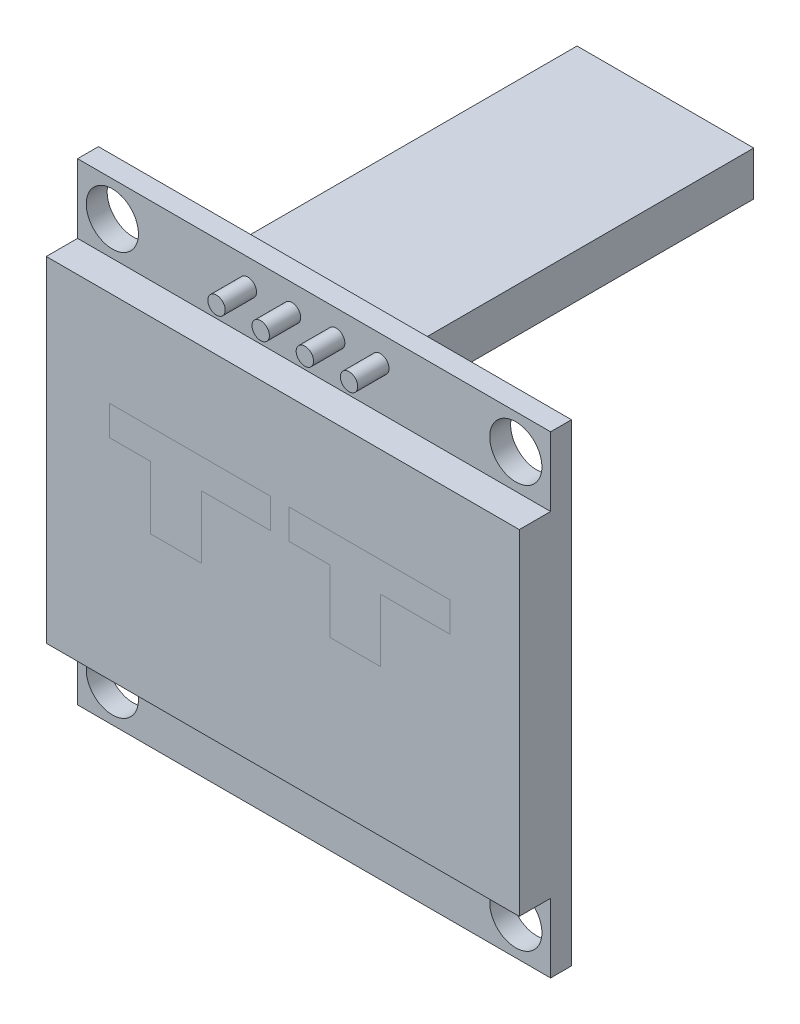
ISO-10303-21;
HEADER;
FILE_DESCRIPTION(('STEP AP214'),'2;1');
FILE_NAME('part.step','',(''),(''),'','','');
FILE_SCHEMA(('AUTOMOTIVE_DESIGN { 1 0 10303 214 1 1 1 1 }'));
ENDSEC;
DATA;
#1=APPLICATION_CONTEXT('core data for automotive mechanical design processes');
#2=APPLICATION_PROTOCOL_DEFINITION('international standard','automotive_design',2000,#1);
#3=PRODUCT_CONTEXT('',#1,'mechanical');
#4=PRODUCT('Part','Part','',(#3));
#5=PRODUCT_RELATED_PRODUCT_CATEGORY('part','',(#4));
#6=PRODUCT_DEFINITION_FORMATION('','',#4);
#7=PRODUCT_DEFINITION_CONTEXT('part definition',#1,'design');
#8=PRODUCT_DEFINITION('design','',#6,#7);
#9=PRODUCT_DEFINITION_SHAPE('','',#8);
#10=(LENGTH_UNIT() NAMED_UNIT(*) SI_UNIT(.MILLI.,.METRE.));
#11=(NAMED_UNIT(*) PLANE_ANGLE_UNIT() SI_UNIT($,.RADIAN.));
#12=(NAMED_UNIT(*) SI_UNIT($,.STERADIAN.) SOLID_ANGLE_UNIT());
#13=UNCERTAINTY_MEASURE_WITH_UNIT(LENGTH_MEASURE(1.E-05),#10,'distance_accuracy_value','');
#14=(GEOMETRIC_REPRESENTATION_CONTEXT(3) GLOBAL_UNCERTAINTY_ASSIGNED_CONTEXT((#13)) GLOBAL_UNIT_ASSIGNED_CONTEXT((#10,
#11,#12)) REPRESENTATION_CONTEXT('',''));
#15=CARTESIAN_POINT('',(0.,0.,0.));
#16=DIRECTION('',(0.,0.,1.));
#17=DIRECTION('',(1.,0.,0.));
#18=AXIS2_PLACEMENT_3D('',#15,#16,#17);
#19=CARTESIAN_POINT('',(0.,0.,3.));
#20=DIRECTION('',(0.,0.,-1.));
#21=DIRECTION('',(-1.,0.,0.));
#22=AXIS2_PLACEMENT_3D('',#19,#20,#21);
#23=PLANE('',#22);
#24=DIRECTION('',(-1.,0.,0.));
#25=VECTOR('',#24,1.);
#26=CARTESIAN_POINT('',(0.,4.13680802778878,3.));
#27=LINE('',#26,#25);
#28=CARTESIAN_POINT('',(-0.710729132527586,4.13680802778878,3.));
#29=VERTEX_POINT('',#28);
#30=CARTESIAN_POINT('',(-9.9684316792971,4.13680802778878,3.));
#31=VERTEX_POINT('',#30);
#32=EDGE_CURVE('E346',#29,#31,#27,.T.);
#33=ORIENTED_EDGE('',*,*,#32,.F.);
#34=DIRECTION('',(0.,1.,0.));
#35=VECTOR('',#34,1.);
#36=CARTESIAN_POINT('',(-0.710729132527586,0.,3.));
#37=LINE('',#36,#35);
#38=CARTESIAN_POINT('',(-0.710729132527586,2.4237685801582,3.));
#39=VERTEX_POINT('',#38);
#40=EDGE_CURVE('E315',#39,#29,#37,.T.);
#41=ORIENTED_EDGE('',*,*,#40,.F.);
#42=DIRECTION('',(1.,0.,0.));
#43=VECTOR('',#42,1.);
#44=CARTESIAN_POINT('',(0.,2.4237685801582,3.));
#45=LINE('',#44,#43);
#46=CARTESIAN_POINT('',(-4.68352274511765,2.4237685801582,3.));
#47=VERTEX_POINT('',#46);
#48=EDGE_CURVE('E328',#47,#39,#45,.T.);
#49=ORIENTED_EDGE('',*,*,#48,.F.);
#50=DIRECTION('',(0.,1.,0.));
#51=VECTOR('',#50,1.);
#52=CARTESIAN_POINT('',(-4.68352274511765,0.,3.));
#53=LINE('',#52,#51);
#54=CARTESIAN_POINT('',(-4.68352274511765,-1.1845485542126,3.));
#55=VERTEX_POINT('',#54);
#56=EDGE_CURVE('E331',#55,#47,#53,.T.);
#57=ORIENTED_EDGE('',*,*,#56,.F.);
#58=DIRECTION('',(1.,0.,0.));
#59=VECTOR('',#58,1.);
#60=CARTESIAN_POINT('',(0.,-1.1845485542126,3.));
#61=LINE('',#60,#59);
#62=CARTESIAN_POINT('',(-7.59933457087183,-1.1845485542126,3.));
#63=VERTEX_POINT('',#62);
#64=EDGE_CURVE('E334',#63,#55,#61,.T.);
#65=ORIENTED_EDGE('',*,*,#64,.F.);
#66=DIRECTION('',(0.,-1.,0.));
#67=VECTOR('',#66,1.);
#68=CARTESIAN_POINT('',(-7.59933457087183,0.,3.));
#69=LINE('',#68,#67);
#70=CARTESIAN_POINT('',(-7.59933457087183,2.4237685801582,3.));
#71=VERTEX_POINT('',#70);
#72=EDGE_CURVE('E337',#71,#63,#69,.T.);
#73=ORIENTED_EDGE('',*,*,#72,.F.);
#74=DIRECTION('',(1.,0.,0.));
#75=VECTOR('',#74,1.);
#76=CARTESIAN_POINT('',(0.,2.4237685801582,3.));
#77=LINE('',#76,#75);
#78=CARTESIAN_POINT('',(-9.9684316792971,2.4237685801582,3.));
#79=VERTEX_POINT('',#78);
#80=EDGE_CURVE('E340',#79,#71,#77,.T.);
#81=ORIENTED_EDGE('',*,*,#80,.F.);
#82=DIRECTION('',(0.,-1.,0.));
#83=VECTOR('',#82,1.);
#84=CARTESIAN_POINT('',(-9.9684316792971,0.,3.));
#85=LINE('',#84,#83);
#86=EDGE_CURVE('E343',#31,#79,#85,.T.);
#87=ORIENTED_EDGE('',*,*,#86,.F.);
#88=EDGE_LOOP('',(#33,#41,#49,#57,#65,#73,#81,#87));
#89=FACE_BOUND('',#88,.T.);
#90=DIRECTION('',(0.,1.,0.));
#91=VECTOR('',#90,1.);
#92=CARTESIAN_POINT('',(13.6,-9.63,3.));
#93=LINE('',#92,#91);
#94=CARTESIAN_POINT('',(13.6,-9.63,3.));
#95=VERTEX_POINT('',#94);
#96=CARTESIAN_POINT('',(13.6,9.63,3.));
#97=VERTEX_POINT('',#96);
#98=EDGE_CURVE('E258',#95,#97,#93,.T.);
#99=ORIENTED_EDGE('',*,*,#98,.T.);
#100=DIRECTION('',(-1.,0.,0.));
#101=VECTOR('',#100,1.);
#102=CARTESIAN_POINT('',(-13.6,9.63,3.));
#103=LINE('',#102,#101);
#104=CARTESIAN_POINT('',(-13.6,9.63,3.));
#105=VERTEX_POINT('',#104);
#106=EDGE_CURVE('E261',#97,#105,#103,.T.);
#107=ORIENTED_EDGE('',*,*,#106,.T.);
#108=DIRECTION('',(0.,-1.,0.));
#109=VECTOR('',#108,1.);
#110=CARTESIAN_POINT('',(-13.6,-9.63,3.));
#111=LINE('',#110,#109);
#112=CARTESIAN_POINT('',(-13.6,-9.63,3.));
#113=VERTEX_POINT('',#112);
#114=EDGE_CURVE('E264',#105,#113,#111,.T.);
#115=ORIENTED_EDGE('',*,*,#114,.T.);
#116=DIRECTION('',(1.,0.,0.));
#117=VECTOR('',#116,1.);
#118=CARTESIAN_POINT('',(-13.6,-9.63,3.));
#119=LINE('',#118,#117);
#120=EDGE_CURVE('E266',#113,#95,#119,.T.);
#121=ORIENTED_EDGE('',*,*,#120,.T.);
#122=EDGE_LOOP('',(#99,#107,#115,#121));
#123=FACE_BOUND('',#122,.T.);
#124=DIRECTION('',(-1.,0.,0.));
#125=VECTOR('',#124,1.);
#126=CARTESIAN_POINT('',(0.,4.13680802778878,3.));
#127=LINE('',#126,#125);
#128=CARTESIAN_POINT('',(9.60395520107782,4.13680802778878,3.));
#129=VERTEX_POINT('',#128);
#130=CARTESIAN_POINT('',(0.346252654308304,4.13680802778878,3.));
#131=VERTEX_POINT('',#130);
#132=EDGE_CURVE('E11',#129,#131,#127,.T.);
#133=ORIENTED_EDGE('',*,*,#132,.F.);
#134=DIRECTION('',(0.,1.,0.));
#135=VECTOR('',#134,1.);
#136=CARTESIAN_POINT('',(9.60395520107782,0.,3.));
#137=LINE('',#136,#135);
#138=CARTESIAN_POINT('',(9.60395520107782,2.4237685801582,3.));
#139=VERTEX_POINT('',#138);
#140=EDGE_CURVE('E349',#139,#129,#137,.T.);
#141=ORIENTED_EDGE('',*,*,#140,.F.);
#142=DIRECTION('',(1.,0.,0.));
#143=VECTOR('',#142,1.);
#144=CARTESIAN_POINT('',(0.,2.4237685801582,3.));
#145=LINE('',#144,#143);
#146=CARTESIAN_POINT('',(5.63116158848776,2.4237685801582,3.));
#147=VERTEX_POINT('',#146);
#148=EDGE_CURVE('E352',#147,#139,#145,.T.);
#149=ORIENTED_EDGE('',*,*,#148,.F.);
#150=DIRECTION('',(0.,1.,0.));
#151=VECTOR('',#150,1.);
#152=CARTESIAN_POINT('',(5.63116158848776,0.,3.));
#153=LINE('',#152,#151);
#154=CARTESIAN_POINT('',(5.63116158848776,-1.1845485542126,3.));
#155=VERTEX_POINT('',#154);
#156=EDGE_CURVE('E355',#155,#147,#153,.T.);
#157=ORIENTED_EDGE('',*,*,#156,.F.);
#158=DIRECTION('',(1.,0.,0.));
#159=VECTOR('',#158,1.);
#160=CARTESIAN_POINT('',(0.,-1.1845485542126,3.));
#161=LINE('',#160,#159);
#162=CARTESIAN_POINT('',(2.71534976273358,-1.1845485542126,3.));
#163=VERTEX_POINT('',#162);
#164=EDGE_CURVE('E358',#163,#155,#161,.T.);
#165=ORIENTED_EDGE('',*,*,#164,.F.);
#166=DIRECTION('',(0.,-1.,0.));
#167=VECTOR('',#166,1.);
#168=CARTESIAN_POINT('',(2.71534976273358,0.,3.));
#169=LINE('',#168,#167);
#170=CARTESIAN_POINT('',(2.71534976273358,2.4237685801582,3.));
#171=VERTEX_POINT('',#170);
#172=EDGE_CURVE('E361',#171,#163,#169,.T.);
#173=ORIENTED_EDGE('',*,*,#172,.F.);
#174=DIRECTION('',(1.,0.,0.));
#175=VECTOR('',#174,1.);
#176=CARTESIAN_POINT('',(0.,2.4237685801582,3.));
#177=LINE('',#176,#175);
#178=CARTESIAN_POINT('',(0.346252654308304,2.4237685801582,3.));
#179=VERTEX_POINT('',#178);
#180=EDGE_CURVE('E364',#179,#171,#177,.T.);
#181=ORIENTED_EDGE('',*,*,#180,.F.);
#182=DIRECTION('',(0.,-1.,0.));
#183=VECTOR('',#182,1.);
#184=CARTESIAN_POINT('',(0.346252654308304,0.,3.));
#185=LINE('',#184,#183);
#186=EDGE_CURVE('E52',#131,#179,#185,.T.);
#187=ORIENTED_EDGE('',*,*,#186,.F.);
#188=EDGE_LOOP('',(#133,#141,#149,#157,#165,#173,#181,#187));
#189=FACE_BOUND('',#188,.T.);
#190=ADVANCED_FACE('F43',(#89,#123,#189),#23,.F.);
#191=ORIENTED_EDGE('',*,*,#140,.T.);
#192=ORIENTED_EDGE('',*,*,#132,.T.);
#193=ORIENTED_EDGE('',*,*,#186,.T.);
#194=ORIENTED_EDGE('',*,*,#180,.T.);
#195=ORIENTED_EDGE('',*,*,#172,.T.);
#196=ORIENTED_EDGE('',*,*,#164,.T.);
#197=ORIENTED_EDGE('',*,*,#156,.T.);
#198=ORIENTED_EDGE('',*,*,#148,.T.);
#199=EDGE_LOOP('',(#191,#192,#193,#194,#195,#196,#197,#198));
#200=FACE_BOUND('',#199,.T.);
#201=ADVANCED_FACE('F400',(#200),#23,.F.);
#202=CARTESIAN_POINT('',(0.,0.,0.));
#203=DIRECTION('',(0.,0.,-1.));
#204=DIRECTION('',(-1.,0.,0.));
#205=AXIS2_PLACEMENT_3D('',#202,#203,#204);
#206=PLANE('',#205);
#207=DIRECTION('',(0.,1.,0.));
#208=VECTOR('',#207,1.);
#209=CARTESIAN_POINT('',(13.6,-13.6,0.));
#210=LINE('',#209,#208);
#211=CARTESIAN_POINT('',(13.6,-13.6,0.));
#212=VERTEX_POINT('',#211);
#213=CARTESIAN_POINT('',(13.6,13.6,0.));
#214=VERTEX_POINT('',#213);
#215=EDGE_CURVE('E284',#212,#214,#210,.T.);
#216=ORIENTED_EDGE('',*,*,#215,.F.);
#217=DIRECTION('',(1.,0.,0.));
#218=VECTOR('',#217,1.);
#219=CARTESIAN_POINT('',(-13.6,-13.6,0.));
#220=LINE('',#219,#218);
#221=CARTESIAN_POINT('',(-13.6,-13.6,0.));
#222=VERTEX_POINT('',#221);
#223=EDGE_CURVE('E302',#222,#212,#220,.T.);
#224=ORIENTED_EDGE('',*,*,#223,.F.);
#225=DIRECTION('',(0.,-1.,0.));
#226=VECTOR('',#225,1.);
#227=CARTESIAN_POINT('',(-13.6,-13.6,0.));
#228=LINE('',#227,#226);
#229=CARTESIAN_POINT('',(-13.6,13.6,0.));
#230=VERTEX_POINT('',#229);
#231=EDGE_CURVE('E300',#230,#222,#228,.T.);
#232=ORIENTED_EDGE('',*,*,#231,.F.);
#233=DIRECTION('',(-1.,0.,0.));
#234=VECTOR('',#233,1.);
#235=CARTESIAN_POINT('',(-13.6,13.6,0.));
#236=LINE('',#235,#234);
#237=EDGE_CURVE('E298',#214,#230,#236,.T.);
#238=ORIENTED_EDGE('',*,*,#237,.F.);
#239=EDGE_LOOP('',(#216,#224,#232,#238));
#240=FACE_BOUND('',#239,.T.);
#241=CARTESIAN_POINT('',(-11.6,11.6,0.));
#242=DIRECTION('',(0.,0.,-1.));
#243=DIRECTION('',(-1.,0.,0.));
#244=AXIS2_PLACEMENT_3D('',#241,#242,#243);
#245=CIRCLE('',#244,1.5);
#246=CARTESIAN_POINT('',(-13.1,11.6,0.));
#247=VERTEX_POINT('',#246);
#248=EDGE_CURVE('E231',#247,#247,#245,.T.);
#249=ORIENTED_EDGE('',*,*,#248,.F.);
#250=EDGE_LOOP('',(#249));
#251=FACE_BOUND('',#250,.T.);
#252=CARTESIAN_POINT('',(-11.6,-11.6,0.));
#253=DIRECTION('',(0.,0.,-1.));
#254=DIRECTION('',(-1.,0.,0.));
#255=AXIS2_PLACEMENT_3D('',#252,#253,#254);
#256=CIRCLE('',#255,1.5);
#257=CARTESIAN_POINT('',(-13.1,-11.6,0.));
#258=VERTEX_POINT('',#257);
#259=EDGE_CURVE('E222',#258,#258,#256,.T.);
#260=ORIENTED_EDGE('',*,*,#259,.F.);
#261=EDGE_LOOP('',(#260));
#262=FACE_BOUND('',#261,.T.);
#263=CARTESIAN_POINT('',(11.6,-11.6,0.));
#264=DIRECTION('',(0.,0.,-1.));
#265=DIRECTION('',(-1.,0.,0.));
#266=AXIS2_PLACEMENT_3D('',#263,#264,#265);
#267=CIRCLE('',#266,1.5);
#268=CARTESIAN_POINT('',(10.1,-11.6,0.));
#269=VERTEX_POINT('',#268);
#270=EDGE_CURVE('E320',#269,#269,#267,.T.);
#271=ORIENTED_EDGE('',*,*,#270,.F.);
#272=EDGE_LOOP('',(#271));
#273=FACE_BOUND('',#272,.T.);
#274=CARTESIAN_POINT('',(11.6,11.6,0.));
#275=DIRECTION('',(0.,0.,-1.));
#276=DIRECTION('',(-1.,0.,0.));
#277=AXIS2_PLACEMENT_3D('',#274,#275,#276);
#278=CIRCLE('',#277,1.5);
#279=CARTESIAN_POINT('',(10.1,11.6,0.));
#280=VERTEX_POINT('',#279);
#281=EDGE_CURVE('E232',#280,#280,#278,.T.);
#282=ORIENTED_EDGE('',*,*,#281,.F.);
#283=EDGE_LOOP('',(#282));
#284=FACE_BOUND('',#283,.T.);
#285=DIRECTION('',(-1.,0.,0.));
#286=VECTOR('',#285,1.);
#287=CARTESIAN_POINT('',(5.08,10.83,0.));
#288=LINE('',#287,#286);
#289=CARTESIAN_POINT('',(5.08,10.83,0.));
#290=VERTEX_POINT('',#289);
#291=CARTESIAN_POINT('',(-5.08,10.83,0.));
#292=VERTEX_POINT('',#291);
#293=EDGE_CURVE('E207',#290,#292,#288,.T.);
#294=ORIENTED_EDGE('',*,*,#293,.F.);
#295=DIRECTION('',(0.,-1.,0.));
#296=VECTOR('',#295,1.);
#297=CARTESIAN_POINT('',(5.08,10.83,0.));
#298=LINE('',#297,#296);
#299=CARTESIAN_POINT('',(5.08,13.37,0.));
#300=VERTEX_POINT('',#299);
#301=EDGE_CURVE('E183',#300,#290,#298,.T.);
#302=ORIENTED_EDGE('',*,*,#301,.F.);
#303=DIRECTION('',(1.,0.,0.));
#304=VECTOR('',#303,1.);
#305=CARTESIAN_POINT('',(5.08,13.37,0.));
#306=LINE('',#305,#304);
#307=CARTESIAN_POINT('',(-5.08,13.37,0.));
#308=VERTEX_POINT('',#307);
#309=EDGE_CURVE('E212',#308,#300,#306,.T.);
#310=ORIENTED_EDGE('',*,*,#309,.F.);
#311=DIRECTION('',(0.,1.,0.));
#312=VECTOR('',#311,1.);
#313=CARTESIAN_POINT('',(-5.08,10.83,0.));
#314=LINE('',#313,#312);
#315=EDGE_CURVE('E209',#292,#308,#314,.T.);
#316=ORIENTED_EDGE('',*,*,#315,.F.);
#317=EDGE_LOOP('',(#294,#302,#310,#316));
#318=FACE_BOUND('',#317,.T.);
#319=ADVANCED_FACE('F413',(#240,#251,#262,#273,#284,#318),#206,.T.);
#320=CARTESIAN_POINT('',(0.,0.,1.2));
#321=DIRECTION('',(0.,0.,-1.));
#322=DIRECTION('',(-1.,0.,0.));
#323=AXIS2_PLACEMENT_3D('',#320,#321,#322);
#324=PLANE('',#323);
#325=CARTESIAN_POINT('',(11.6,-11.6,1.2));
#326=DIRECTION('',(0.,0.,1.));
#327=DIRECTION('',(1.,0.,0.));
#328=AXIS2_PLACEMENT_3D('',#325,#326,#327);
#329=CIRCLE('',#328,1.5);
#330=CARTESIAN_POINT('',(13.1,-11.6,1.2));
#331=VERTEX_POINT('',#330);
#332=EDGE_CURVE('E223',#331,#331,#329,.T.);
#333=ORIENTED_EDGE('',*,*,#332,.F.);
#334=EDGE_LOOP('',(#333));
#335=FACE_BOUND('',#334,.T.);
#336=CARTESIAN_POINT('',(-11.6,-11.6,1.2));
#337=DIRECTION('',(0.,0.,1.));
#338=DIRECTION('',(1.,0.,0.));
#339=AXIS2_PLACEMENT_3D('',#336,#337,#338);
#340=CIRCLE('',#339,1.5);
#341=CARTESIAN_POINT('',(-10.1,-11.6,1.2));
#342=VERTEX_POINT('',#341);
#343=EDGE_CURVE('E186',#342,#342,#340,.T.);
#344=ORIENTED_EDGE('',*,*,#343,.F.);
#345=EDGE_LOOP('',(#344));
#346=FACE_BOUND('',#345,.T.);
#347=DIRECTION('',(1.,0.,0.));
#348=VECTOR('',#347,1.);
#349=CARTESIAN_POINT('',(-13.6,-9.63,1.2));
#350=LINE('',#349,#348);
#351=CARTESIAN_POINT('',(-13.6,-9.63,1.2));
#352=VERTEX_POINT('',#351);
#353=CARTESIAN_POINT('',(13.6,-9.63,1.2));
#354=VERTEX_POINT('',#353);
#355=EDGE_CURVE('E262',#352,#354,#350,.T.);
#356=ORIENTED_EDGE('',*,*,#355,.F.);
#357=DIRECTION('',(0.,-1.,0.));
#358=VECTOR('',#357,1.);
#359=CARTESIAN_POINT('',(-13.6,-13.6,1.2));
#360=LINE('',#359,#358);
#361=CARTESIAN_POINT('',(-13.6,-13.6,1.2));
#362=VERTEX_POINT('',#361);
#363=EDGE_CURVE('E290',#352,#362,#360,.T.);
#364=ORIENTED_EDGE('',*,*,#363,.T.);
#365=DIRECTION('',(1.,0.,0.));
#366=VECTOR('',#365,1.);
#367=CARTESIAN_POINT('',(-13.6,-13.6,1.2));
#368=LINE('',#367,#366);
#369=CARTESIAN_POINT('',(13.6,-13.6,1.2));
#370=VERTEX_POINT('',#369);
#371=EDGE_CURVE('E293',#362,#370,#368,.T.);
#372=ORIENTED_EDGE('',*,*,#371,.T.);
#373=DIRECTION('',(0.,1.,0.));
#374=VECTOR('',#373,1.);
#375=CARTESIAN_POINT('',(13.6,-13.6,1.2));
#376=LINE('',#375,#374);
#377=EDGE_CURVE('E285',#370,#354,#376,.T.);
#378=ORIENTED_EDGE('',*,*,#377,.T.);
#379=EDGE_LOOP('',(#356,#364,#372,#378));
#380=FACE_BOUND('',#379,.T.);
#381=ADVANCED_FACE('F443',(#335,#346,#380),#324,.F.);
#382=CARTESIAN_POINT('',(11.6,11.6,1.2));
#383=DIRECTION('',(0.,0.,1.));
#384=DIRECTION('',(1.,0.,0.));
#385=AXIS2_PLACEMENT_3D('',#382,#383,#384);
#386=CIRCLE('',#385,1.5);
#387=CARTESIAN_POINT('',(13.1,11.6,1.2));
#388=VERTEX_POINT('',#387);
#389=EDGE_CURVE('E219',#388,#388,#386,.T.);
#390=ORIENTED_EDGE('',*,*,#389,.F.);
#391=EDGE_LOOP('',(#390));
#392=FACE_BOUND('',#391,.T.);
#393=CARTESIAN_POINT('',(-11.6,11.6,1.2));
#394=DIRECTION('',(0.,0.,1.));
#395=DIRECTION('',(1.,0.,0.));
#396=AXIS2_PLACEMENT_3D('',#393,#394,#395);
#397=CIRCLE('',#396,1.5);
#398=CARTESIAN_POINT('',(-10.1,11.6,1.2));
#399=VERTEX_POINT('',#398);
#400=EDGE_CURVE('E228',#399,#399,#397,.T.);
#401=ORIENTED_EDGE('',*,*,#400,.F.);
#402=EDGE_LOOP('',(#401));
#403=FACE_BOUND('',#402,.T.);
#404=CARTESIAN_POINT('',(3.81,12.1,1.2));
#405=DIRECTION('',(0.,0.,-1.));
#406=DIRECTION('',(-1.,0.,0.));
#407=AXIS2_PLACEMENT_3D('',#404,#405,#406);
#408=CIRCLE('',#407,0.500000000000001);
#409=CARTESIAN_POINT('',(3.31,12.1,1.2));
#410=VERTEX_POINT('',#409);
#411=EDGE_CURVE('E236',#410,#410,#408,.T.);
#412=ORIENTED_EDGE('',*,*,#411,.T.);
#413=EDGE_LOOP('',(#412));
#414=FACE_BOUND('',#413,.T.);
#415=CARTESIAN_POINT('',(1.27,12.1,1.2));
#416=DIRECTION('',(0.,0.,-1.));
#417=DIRECTION('',(-1.,0.,0.));
#418=AXIS2_PLACEMENT_3D('',#415,#416,#417);
#419=CIRCLE('',#418,0.5);
#420=CARTESIAN_POINT('',(0.770000000000003,12.1,1.2));
#421=VERTEX_POINT('',#420);
#422=EDGE_CURVE('E242',#421,#421,#419,.T.);
#423=ORIENTED_EDGE('',*,*,#422,.T.);
#424=EDGE_LOOP('',(#423));
#425=FACE_BOUND('',#424,.T.);
#426=CARTESIAN_POINT('',(-1.27,12.1,1.2));
#427=DIRECTION('',(0.,0.,-1.));
#428=DIRECTION('',(-1.,0.,0.));
#429=AXIS2_PLACEMENT_3D('',#426,#427,#428);
#430=CIRCLE('',#429,0.5);
#431=CARTESIAN_POINT('',(-1.77,12.1,1.2));
#432=VERTEX_POINT('',#431);
#433=EDGE_CURVE('E248',#432,#432,#430,.T.);
#434=ORIENTED_EDGE('',*,*,#433,.T.);
#435=EDGE_LOOP('',(#434));
#436=FACE_BOUND('',#435,.T.);
#437=CARTESIAN_POINT('',(-3.81,12.1,1.2));
#438=DIRECTION('',(0.,0.,-1.));
#439=DIRECTION('',(-1.,0.,0.));
#440=AXIS2_PLACEMENT_3D('',#437,#438,#439);
#441=CIRCLE('',#440,0.5);
#442=CARTESIAN_POINT('',(-4.31,12.1,1.2));
#443=VERTEX_POINT('',#442);
#444=EDGE_CURVE('E254',#443,#443,#441,.T.);
#445=ORIENTED_EDGE('',*,*,#444,.T.);
#446=EDGE_LOOP('',(#445));
#447=FACE_BOUND('',#446,.T.);
#448=DIRECTION('',(-1.,0.,0.));
#449=VECTOR('',#448,1.);
#450=CARTESIAN_POINT('',(-13.6,9.63,1.2));
#451=LINE('',#450,#449);
#452=CARTESIAN_POINT('',(13.6,9.63,1.2));
#453=VERTEX_POINT('',#452);
#454=CARTESIAN_POINT('',(-13.6,9.63,1.2));
#455=VERTEX_POINT('',#454);
#456=EDGE_CURVE('E257',#453,#455,#451,.T.);
#457=ORIENTED_EDGE('',*,*,#456,.F.);
#458=CARTESIAN_POINT('',(13.6,13.6,1.2));
#459=VERTEX_POINT('',#458);
#460=EDGE_CURVE('E288',#453,#459,#376,.T.);
#461=ORIENTED_EDGE('',*,*,#460,.T.);
#462=DIRECTION('',(-1.,0.,0.));
#463=VECTOR('',#462,1.);
#464=CARTESIAN_POINT('',(-13.6,13.6,1.2));
#465=LINE('',#464,#463);
#466=CARTESIAN_POINT('',(-13.6,13.6,1.2));
#467=VERTEX_POINT('',#466);
#468=EDGE_CURVE('E287',#459,#467,#465,.T.);
#469=ORIENTED_EDGE('',*,*,#468,.T.);
#470=EDGE_CURVE('E291',#467,#455,#360,.T.);
#471=ORIENTED_EDGE('',*,*,#470,.T.);
#472=EDGE_LOOP('',(#457,#461,#469,#471));
#473=FACE_BOUND('',#472,.T.);
#474=ADVANCED_FACE('F446',(#392,#403,#414,#425,#436,#447,#473),#324,.F.);
#475=CARTESIAN_POINT('',(13.6,-13.6,1.2));
#476=DIRECTION('',(-1.,0.,0.));
#477=DIRECTION('',(0.,0.,1.));
#478=AXIS2_PLACEMENT_3D('',#475,#476,#477);
#479=PLANE('',#478);
#480=ORIENTED_EDGE('',*,*,#215,.T.);
#481=DIRECTION('',(0.,0.,-1.));
#482=VECTOR('',#481,1.);
#483=CARTESIAN_POINT('',(13.6,13.6,1.2));
#484=LINE('',#483,#482);
#485=EDGE_CURVE('E312',#459,#214,#484,.T.);
#486=ORIENTED_EDGE('',*,*,#485,.F.);
#487=ORIENTED_EDGE('',*,*,#460,.F.);
#488=DIRECTION('',(0.,0.,-1.));
#489=VECTOR('',#488,1.);
#490=CARTESIAN_POINT('',(13.6,9.63,3.));
#491=LINE('',#490,#489);
#492=EDGE_CURVE('E281',#97,#453,#491,.T.);
#493=ORIENTED_EDGE('',*,*,#492,.F.);
#494=ORIENTED_EDGE('',*,*,#98,.F.);
#495=DIRECTION('',(0.,0.,-1.));
#496=VECTOR('',#495,1.);
#497=CARTESIAN_POINT('',(13.6,-9.63,3.));
#498=LINE('',#497,#496);
#499=EDGE_CURVE('E268',#95,#354,#498,.T.);
#500=ORIENTED_EDGE('',*,*,#499,.T.);
#501=ORIENTED_EDGE('',*,*,#377,.F.);
#502=DIRECTION('',(0.,0.,-1.));
#503=VECTOR('',#502,1.);
#504=CARTESIAN_POINT('',(13.6,-13.6,1.2));
#505=LINE('',#504,#503);
#506=EDGE_CURVE('E295',#370,#212,#505,.T.);
#507=ORIENTED_EDGE('',*,*,#506,.T.);
#508=EDGE_LOOP('',(#480,#486,#487,#493,#494,#500,#501,#507));
#509=FACE_BOUND('',#508,.T.);
#510=ADVANCED_FACE('F45',(#509),#479,.F.);
#511=CARTESIAN_POINT('',(-13.6,13.6,1.2));
#512=DIRECTION('',(0.,-1.,0.));
#513=DIRECTION('',(0.,0.,-1.));
#514=AXIS2_PLACEMENT_3D('',#511,#512,#513);
#515=PLANE('',#514);
#516=ORIENTED_EDGE('',*,*,#237,.T.);
#517=DIRECTION('',(0.,0.,-1.));
#518=VECTOR('',#517,1.);
#519=CARTESIAN_POINT('',(-13.6,13.6,1.2));
#520=LINE('',#519,#518);
#521=EDGE_CURVE('E309',#467,#230,#520,.T.);
#522=ORIENTED_EDGE('',*,*,#521,.F.);
#523=ORIENTED_EDGE('',*,*,#468,.F.);
#524=ORIENTED_EDGE('',*,*,#485,.T.);
#525=EDGE_LOOP('',(#516,#522,#523,#524));
#526=FACE_BOUND('',#525,.T.);
#527=ADVANCED_FACE('F456',(#526),#515,.F.);
#528=CARTESIAN_POINT('',(-13.6,-13.6,1.2));
#529=DIRECTION('',(1.,0.,0.));
#530=DIRECTION('',(0.,0.,-1.));
#531=AXIS2_PLACEMENT_3D('',#528,#529,#530);
#532=PLANE('',#531);
#533=ORIENTED_EDGE('',*,*,#231,.T.);
#534=DIRECTION('',(0.,0.,-1.));
#535=VECTOR('',#534,1.);
#536=CARTESIAN_POINT('',(-13.6,-13.6,1.2));
#537=LINE('',#536,#535);
#538=EDGE_CURVE('E306',#362,#222,#537,.T.);
#539=ORIENTED_EDGE('',*,*,#538,.F.);
#540=ORIENTED_EDGE('',*,*,#363,.F.);
#541=DIRECTION('',(0.,0.,-1.));
#542=VECTOR('',#541,1.);
#543=CARTESIAN_POINT('',(-13.6,-9.63,3.));
#544=LINE('',#543,#542);
#545=EDGE_CURVE('E275',#113,#352,#544,.T.);
#546=ORIENTED_EDGE('',*,*,#545,.F.);
#547=ORIENTED_EDGE('',*,*,#114,.F.);
#548=DIRECTION('',(0.,0.,-1.));
#549=VECTOR('',#548,1.);
#550=CARTESIAN_POINT('',(-13.6,9.63,3.));
#551=LINE('',#550,#549);
#552=EDGE_CURVE('E278',#105,#455,#551,.T.);
#553=ORIENTED_EDGE('',*,*,#552,.T.);
#554=ORIENTED_EDGE('',*,*,#470,.F.);
#555=ORIENTED_EDGE('',*,*,#521,.T.);
#556=EDGE_LOOP('',(#533,#539,#540,#546,#547,#553,#554,#555));
#557=FACE_BOUND('',#556,.T.);
#558=ADVANCED_FACE('F453',(#557),#532,.F.);
#559=CARTESIAN_POINT('',(-13.6,-13.6,1.2));
#560=DIRECTION('',(0.,1.,0.));
#561=DIRECTION('',(0.,0.,1.));
#562=AXIS2_PLACEMENT_3D('',#559,#560,#561);
#563=PLANE('',#562);
#564=ORIENTED_EDGE('',*,*,#223,.T.);
#565=ORIENTED_EDGE('',*,*,#506,.F.);
#566=ORIENTED_EDGE('',*,*,#371,.F.);
#567=ORIENTED_EDGE('',*,*,#538,.T.);
#568=EDGE_LOOP('',(#564,#565,#566,#567));
#569=FACE_BOUND('',#568,.T.);
#570=ADVANCED_FACE('F439',(#569),#563,.F.);
#571=CARTESIAN_POINT('',(-13.6,9.63,3.));
#572=DIRECTION('',(0.,-1.,0.));
#573=DIRECTION('',(0.,0.,-1.));
#574=AXIS2_PLACEMENT_3D('',#571,#572,#573);
#575=PLANE('',#574);
#576=ORIENTED_EDGE('',*,*,#456,.T.);
#577=ORIENTED_EDGE('',*,*,#552,.F.);
#578=ORIENTED_EDGE('',*,*,#106,.F.);
#579=ORIENTED_EDGE('',*,*,#492,.T.);
#580=EDGE_LOOP('',(#576,#577,#578,#579));
#581=FACE_BOUND('',#580,.T.);
#582=ADVANCED_FACE('F427',(#581),#575,.F.);
#583=CARTESIAN_POINT('',(-13.6,-9.63,3.));
#584=DIRECTION('',(0.,1.,0.));
#585=DIRECTION('',(0.,0.,1.));
#586=AXIS2_PLACEMENT_3D('',#583,#584,#585);
#587=PLANE('',#586);
#588=ORIENTED_EDGE('',*,*,#355,.T.);
#589=ORIENTED_EDGE('',*,*,#499,.F.);
#590=ORIENTED_EDGE('',*,*,#120,.F.);
#591=ORIENTED_EDGE('',*,*,#545,.T.);
#592=EDGE_LOOP('',(#588,#589,#590,#591));
#593=FACE_BOUND('',#592,.T.);
#594=ADVANCED_FACE('F419',(#593),#587,.F.);
#595=ORIENTED_EDGE('',*,*,#40,.T.);
#596=ORIENTED_EDGE('',*,*,#32,.T.);
#597=ORIENTED_EDGE('',*,*,#86,.T.);
#598=ORIENTED_EDGE('',*,*,#80,.T.);
#599=ORIENTED_EDGE('',*,*,#72,.T.);
#600=ORIENTED_EDGE('',*,*,#64,.T.);
#601=ORIENTED_EDGE('',*,*,#56,.T.);
#602=ORIENTED_EDGE('',*,*,#48,.T.);
#603=EDGE_LOOP('',(#595,#596,#597,#598,#599,#600,#601,#602));
#604=FACE_BOUND('',#603,.T.);
#605=ADVANCED_FACE('F409',(#604),#23,.F.);
#606=CARTESIAN_POINT('',(-3.81,12.1,-8.));
#607=DIRECTION('',(0.,0.,1.));
#608=DIRECTION('',(1.,0.,0.));
#609=AXIS2_PLACEMENT_3D('',#606,#607,#608);
#610=CYLINDRICAL_SURFACE('',#609,0.5);
#611=CARTESIAN_POINT('',(-3.81,12.1,3.));
#612=DIRECTION('',(0.,0.,-1.));
#613=DIRECTION('',(-1.,0.,0.));
#614=AXIS2_PLACEMENT_3D('',#611,#612,#613);
#615=CIRCLE('',#614,0.5);
#616=CARTESIAN_POINT('',(-4.31,12.1,3.));
#617=VERTEX_POINT('',#616);
#618=EDGE_CURVE('E251',#617,#617,#615,.T.);
#619=ORIENTED_EDGE('',*,*,#618,.T.);
#620=EDGE_LOOP('',(#619));
#621=FACE_BOUND('',#620,.T.);
#622=ORIENTED_EDGE('',*,*,#444,.F.);
#623=EDGE_LOOP('',(#622));
#624=FACE_BOUND('',#623,.T.);
#625=ADVANCED_FACE('F418',(#621,#624),#610,.T.);
#626=CARTESIAN_POINT('',(0.,0.,3.));
#627=DIRECTION('',(0.,0.,-1.));
#628=DIRECTION('',(-1.,0.,0.));
#629=AXIS2_PLACEMENT_3D('',#626,#627,#628);
#630=PLANE('',#629);
#631=ORIENTED_EDGE('',*,*,#618,.F.);
#632=EDGE_LOOP('',(#631));
#633=FACE_BOUND('',#632,.T.);
#634=ADVANCED_FACE('F425',(#633),#630,.F.);
#635=CARTESIAN_POINT('',(-1.27,12.1,-8.));
#636=DIRECTION('',(0.,0.,1.));
#637=DIRECTION('',(1.,0.,0.));
#638=AXIS2_PLACEMENT_3D('',#635,#636,#637);
#639=CYLINDRICAL_SURFACE('',#638,0.5);
#640=CARTESIAN_POINT('',(-1.27,12.1,3.));
#641=DIRECTION('',(0.,0.,-1.));
#642=DIRECTION('',(-1.,0.,0.));
#643=AXIS2_PLACEMENT_3D('',#640,#641,#642);
#644=CIRCLE('',#643,0.5);
#645=CARTESIAN_POINT('',(-1.77,12.1,3.));
#646=VERTEX_POINT('',#645);
#647=EDGE_CURVE('E245',#646,#646,#644,.T.);
#648=ORIENTED_EDGE('',*,*,#647,.T.);
#649=EDGE_LOOP('',(#648));
#650=FACE_BOUND('',#649,.T.);
#651=ORIENTED_EDGE('',*,*,#433,.F.);
#652=EDGE_LOOP('',(#651));
#653=FACE_BOUND('',#652,.T.);
#654=ADVANCED_FACE('F504',(#650,#653),#639,.T.);
#655=CARTESIAN_POINT('',(0.,0.,3.));
#656=DIRECTION('',(0.,0.,-1.));
#657=DIRECTION('',(-1.,0.,0.));
#658=AXIS2_PLACEMENT_3D('',#655,#656,#657);
#659=PLANE('',#658);
#660=ORIENTED_EDGE('',*,*,#647,.F.);
#661=EDGE_LOOP('',(#660));
#662=FACE_BOUND('',#661,.T.);
#663=ADVANCED_FACE('F506',(#662),#659,.F.);
#664=CARTESIAN_POINT('',(1.27,12.1,-8.));
#665=DIRECTION('',(0.,0.,1.));
#666=DIRECTION('',(1.,0.,0.));
#667=AXIS2_PLACEMENT_3D('',#664,#665,#666);
#668=CYLINDRICAL_SURFACE('',#667,0.5);
#669=CARTESIAN_POINT('',(1.27,12.1,3.));
#670=DIRECTION('',(0.,0.,-1.));
#671=DIRECTION('',(-1.,0.,0.));
#672=AXIS2_PLACEMENT_3D('',#669,#670,#671);
#673=CIRCLE('',#672,0.5);
#674=CARTESIAN_POINT('',(0.770000000000003,12.1,3.));
#675=VERTEX_POINT('',#674);
#676=EDGE_CURVE('E239',#675,#675,#673,.T.);
#677=ORIENTED_EDGE('',*,*,#676,.T.);
#678=EDGE_LOOP('',(#677));
#679=FACE_BOUND('',#678,.T.);
#680=ORIENTED_EDGE('',*,*,#422,.F.);
#681=EDGE_LOOP('',(#680));
#682=FACE_BOUND('',#681,.T.);
#683=ADVANCED_FACE('F513',(#679,#682),#668,.T.);
#684=CARTESIAN_POINT('',(0.,0.,3.));
#685=DIRECTION('',(0.,0.,-1.));
#686=DIRECTION('',(-1.,0.,0.));
#687=AXIS2_PLACEMENT_3D('',#684,#685,#686);
#688=PLANE('',#687);
#689=ORIENTED_EDGE('',*,*,#676,.F.);
#690=EDGE_LOOP('',(#689));
#691=FACE_BOUND('',#690,.T.);
#692=ADVANCED_FACE('F521',(#691),#688,.F.);
#693=CARTESIAN_POINT('',(3.81,12.1,-8.));
#694=DIRECTION('',(0.,0.,1.));
#695=DIRECTION('',(1.,0.,0.));
#696=AXIS2_PLACEMENT_3D('',#693,#694,#695);
#697=CYLINDRICAL_SURFACE('',#696,0.500000000000001);
#698=CARTESIAN_POINT('',(3.81,12.1,3.));
#699=DIRECTION('',(0.,0.,-1.));
#700=DIRECTION('',(-1.,0.,0.));
#701=AXIS2_PLACEMENT_3D('',#698,#699,#700);
#702=CIRCLE('',#701,0.500000000000001);
#703=CARTESIAN_POINT('',(3.31,12.1,3.));
#704=VERTEX_POINT('',#703);
#705=EDGE_CURVE('E233',#704,#704,#702,.T.);
#706=ORIENTED_EDGE('',*,*,#705,.T.);
#707=EDGE_LOOP('',(#706));
#708=FACE_BOUND('',#707,.T.);
#709=ORIENTED_EDGE('',*,*,#411,.F.);
#710=EDGE_LOOP('',(#709));
#711=FACE_BOUND('',#710,.T.);
#712=ADVANCED_FACE('F525',(#708,#711),#697,.T.);
#713=CARTESIAN_POINT('',(0.,0.,3.));
#714=DIRECTION('',(0.,0.,-1.));
#715=DIRECTION('',(-1.,0.,0.));
#716=AXIS2_PLACEMENT_3D('',#713,#714,#715);
#717=PLANE('',#716);
#718=ORIENTED_EDGE('',*,*,#705,.F.);
#719=EDGE_LOOP('',(#718));
#720=FACE_BOUND('',#719,.T.);
#721=ADVANCED_FACE('F529',(#720),#717,.F.);
#722=CARTESIAN_POINT('',(-11.6,11.6,-8.));
#723=DIRECTION('',(0.,0.,1.));
#724=DIRECTION('',(1.,0.,0.));
#725=AXIS2_PLACEMENT_3D('',#722,#723,#724);
#726=CYLINDRICAL_SURFACE('',#725,1.5);
#727=ORIENTED_EDGE('',*,*,#248,.T.);
#728=EDGE_LOOP('',(#727));
#729=FACE_BOUND('',#728,.T.);
#730=ORIENTED_EDGE('',*,*,#400,.T.);
#731=EDGE_LOOP('',(#730));
#732=FACE_BOUND('',#731,.T.);
#733=ADVANCED_FACE('F533',(#729,#732),#726,.F.);
#734=CARTESIAN_POINT('',(-11.6,-11.6,-8.));
#735=DIRECTION('',(0.,0.,1.));
#736=DIRECTION('',(1.,0.,0.));
#737=AXIS2_PLACEMENT_3D('',#734,#735,#736);
#738=CYLINDRICAL_SURFACE('',#737,1.5);
#739=ORIENTED_EDGE('',*,*,#259,.T.);
#740=EDGE_LOOP('',(#739));
#741=FACE_BOUND('',#740,.T.);
#742=ORIENTED_EDGE('',*,*,#343,.T.);
#743=EDGE_LOOP('',(#742));
#744=FACE_BOUND('',#743,.T.);
#745=ADVANCED_FACE('F537',(#741,#744),#738,.F.);
#746=CARTESIAN_POINT('',(11.6,-11.6,-8.));
#747=DIRECTION('',(0.,0.,1.));
#748=DIRECTION('',(1.,0.,0.));
#749=AXIS2_PLACEMENT_3D('',#746,#747,#748);
#750=CYLINDRICAL_SURFACE('',#749,1.5);
#751=ORIENTED_EDGE('',*,*,#270,.T.);
#752=EDGE_LOOP('',(#751));
#753=FACE_BOUND('',#752,.T.);
#754=ORIENTED_EDGE('',*,*,#332,.T.);
#755=EDGE_LOOP('',(#754));
#756=FACE_BOUND('',#755,.T.);
#757=ADVANCED_FACE('F541',(#753,#756),#750,.F.);
#758=CARTESIAN_POINT('',(11.6,11.6,-8.));
#759=DIRECTION('',(0.,0.,1.));
#760=DIRECTION('',(1.,0.,0.));
#761=AXIS2_PLACEMENT_3D('',#758,#759,#760);
#762=CYLINDRICAL_SURFACE('',#761,1.5);
#763=ORIENTED_EDGE('',*,*,#281,.T.);
#764=EDGE_LOOP('',(#763));
#765=FACE_BOUND('',#764,.T.);
#766=ORIENTED_EDGE('',*,*,#389,.T.);
#767=EDGE_LOOP('',(#766));
#768=FACE_BOUND('',#767,.T.);
#769=ADVANCED_FACE('F545',(#765,#768),#762,.F.);
#770=CARTESIAN_POINT('',(5.08,10.83,-2.));
#771=DIRECTION('',(-1.,0.,0.));
#772=DIRECTION('',(0.,0.,1.));
#773=AXIS2_PLACEMENT_3D('',#770,#771,#772);
#774=PLANE('',#773);
#775=ORIENTED_EDGE('',*,*,#301,.T.);
#776=DIRECTION('',(0.,0.,1.));
#777=VECTOR('',#776,1.);
#778=CARTESIAN_POINT('',(5.08,10.83,-2.));
#779=LINE('',#778,#777);
#780=CARTESIAN_POINT('',(5.08,10.83,-19.));
#781=VERTEX_POINT('',#780);
#782=EDGE_CURVE('E176',#781,#290,#779,.T.);
#783=ORIENTED_EDGE('',*,*,#782,.F.);
#784=DIRECTION('',(0.,-1.,0.));
#785=VECTOR('',#784,1.);
#786=CARTESIAN_POINT('',(5.08000000000001,13.37,-19.));
#787=LINE('',#786,#785);
#788=CARTESIAN_POINT('',(5.08000000000001,13.37,-19.));
#789=VERTEX_POINT('',#788);
#790=EDGE_CURVE('E181',#789,#781,#787,.T.);
#791=ORIENTED_EDGE('',*,*,#790,.F.);
#792=DIRECTION('',(0.,0.,1.));
#793=VECTOR('',#792,1.);
#794=CARTESIAN_POINT('',(5.08,13.37,-2.));
#795=LINE('',#794,#793);
#796=EDGE_CURVE('E214',#789,#300,#795,.T.);
#797=ORIENTED_EDGE('',*,*,#796,.T.);
#798=EDGE_LOOP('',(#775,#783,#791,#797));
#799=FACE_BOUND('',#798,.T.);
#800=ADVANCED_FACE('F178',(#799),#774,.F.);
#801=CARTESIAN_POINT('',(5.08,10.83,-2.));
#802=DIRECTION('',(0.,1.,0.));
#803=DIRECTION('',(0.,0.,1.));
#804=AXIS2_PLACEMENT_3D('',#801,#802,#803);
#805=PLANE('',#804);
#806=ORIENTED_EDGE('',*,*,#293,.T.);
#807=DIRECTION('',(0.,0.,1.));
#808=VECTOR('',#807,1.);
#809=CARTESIAN_POINT('',(-5.08,10.83,-2.));
#810=LINE('',#809,#808);
#811=CARTESIAN_POINT('',(-5.08,10.83,-19.));
#812=VERTEX_POINT('',#811);
#813=EDGE_CURVE('E187',#812,#292,#810,.T.);
#814=ORIENTED_EDGE('',*,*,#813,.F.);
#815=DIRECTION('',(-1.,0.,0.));
#816=VECTOR('',#815,1.);
#817=CARTESIAN_POINT('',(5.08,10.83,-19.));
#818=LINE('',#817,#816);
#819=EDGE_CURVE('E190',#781,#812,#818,.T.);
#820=ORIENTED_EDGE('',*,*,#819,.F.);
#821=ORIENTED_EDGE('',*,*,#782,.T.);
#822=EDGE_LOOP('',(#806,#814,#820,#821));
#823=FACE_BOUND('',#822,.T.);
#824=ADVANCED_FACE('F191',(#823),#805,.F.);
#825=CARTESIAN_POINT('',(-5.08,10.83,-2.));
#826=DIRECTION('',(1.,0.,0.));
#827=DIRECTION('',(0.,0.,-1.));
#828=AXIS2_PLACEMENT_3D('',#825,#826,#827);
#829=PLANE('',#828);
#830=ORIENTED_EDGE('',*,*,#315,.T.);
#831=DIRECTION('',(0.,0.,1.));
#832=VECTOR('',#831,1.);
#833=CARTESIAN_POINT('',(-5.08,13.37,-2.));
#834=LINE('',#833,#832);
#835=CARTESIAN_POINT('',(-5.08,13.37,-19.));
#836=VERTEX_POINT('',#835);
#837=EDGE_CURVE('E216',#836,#308,#834,.T.);
#838=ORIENTED_EDGE('',*,*,#837,.F.);
#839=DIRECTION('',(0.,1.,0.));
#840=VECTOR('',#839,1.);
#841=CARTESIAN_POINT('',(-5.08,13.37,-19.));
#842=LINE('',#841,#840);
#843=EDGE_CURVE('E196',#812,#836,#842,.T.);
#844=ORIENTED_EDGE('',*,*,#843,.F.);
#845=ORIENTED_EDGE('',*,*,#813,.T.);
#846=EDGE_LOOP('',(#830,#838,#844,#845));
#847=FACE_BOUND('',#846,.T.);
#848=ADVANCED_FACE('F554',(#847),#829,.F.);
#849=CARTESIAN_POINT('',(5.08,13.37,-2.));
#850=DIRECTION('',(0.,-1.,0.));
#851=DIRECTION('',(0.,0.,-1.));
#852=AXIS2_PLACEMENT_3D('',#849,#850,#851);
#853=PLANE('',#852);
#854=ORIENTED_EDGE('',*,*,#309,.T.);
#855=ORIENTED_EDGE('',*,*,#796,.F.);
#856=DIRECTION('',(1.,0.,0.));
#857=VECTOR('',#856,1.);
#858=CARTESIAN_POINT('',(5.08000000000001,13.37,-19.));
#859=LINE('',#858,#857);
#860=EDGE_CURVE('E201',#836,#789,#859,.T.);
#861=ORIENTED_EDGE('',*,*,#860,.F.);
#862=ORIENTED_EDGE('',*,*,#837,.T.);
#863=EDGE_LOOP('',(#854,#855,#861,#862));
#864=FACE_BOUND('',#863,.T.);
#865=ADVANCED_FACE('F557',(#864),#853,.F.);
#866=CARTESIAN_POINT('',(0.,0.,-19.));
#867=DIRECTION('',(0.,0.,-1.));
#868=DIRECTION('',(-1.,0.,0.));
#869=AXIS2_PLACEMENT_3D('',#866,#867,#868);
#870=PLANE('',#869);
#871=ORIENTED_EDGE('',*,*,#790,.T.);
#872=ORIENTED_EDGE('',*,*,#819,.T.);
#873=ORIENTED_EDGE('',*,*,#843,.T.);
#874=ORIENTED_EDGE('',*,*,#860,.T.);
#875=EDGE_LOOP('',(#871,#872,#873,#874));
#876=FACE_BOUND('',#875,.T.);
#877=ADVANCED_FACE('F199',(#876),#870,.T.);
#878=CLOSED_SHELL('',(#190,#201,#319,#381,#474,#510,#527,#558,#570,#582,#594,#605,#625,#634,
#654,#663,#683,#692,#712,#721,#733,#745,#757,#769,#800,#824,#848,#865,#877));
#879=MANIFOLD_SOLID_BREP('B2',#878);
#880=ADVANCED_BREP_SHAPE_REPRESENTATION('',(#18,#879),#14);
#881=SHAPE_DEFINITION_REPRESENTATION(#9,#880);
ENDSEC;
END-ISO-10303-21;
